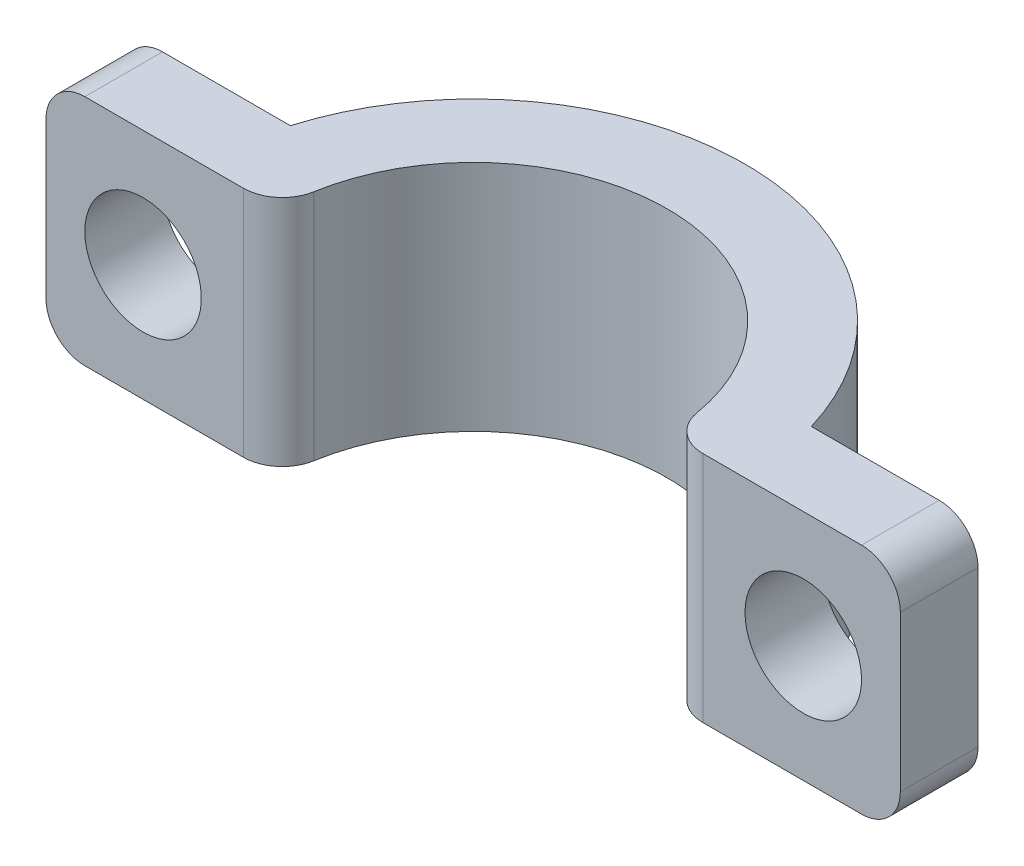
ISO-10303-21;
HEADER;
FILE_DESCRIPTION(('STEP AP214'),'2;1');
FILE_NAME('part.step','',(''),(''),'','','');
FILE_SCHEMA(('AUTOMOTIVE_DESIGN { 1 0 10303 214 1 1 1 1 }'));
ENDSEC;
DATA;
#1=APPLICATION_CONTEXT('core data for automotive mechanical design processes');
#2=APPLICATION_PROTOCOL_DEFINITION('international standard','automotive_design',2000,#1);
#3=PRODUCT_CONTEXT('',#1,'mechanical');
#4=PRODUCT('Part','Part','',(#3));
#5=PRODUCT_RELATED_PRODUCT_CATEGORY('part','',(#4));
#6=PRODUCT_DEFINITION_FORMATION('','',#4);
#7=PRODUCT_DEFINITION_CONTEXT('part definition',#1,'design');
#8=PRODUCT_DEFINITION('design','',#6,#7);
#9=PRODUCT_DEFINITION_SHAPE('','',#8);
#10=(LENGTH_UNIT() NAMED_UNIT(*) SI_UNIT(.MILLI.,.METRE.));
#11=(NAMED_UNIT(*) PLANE_ANGLE_UNIT() SI_UNIT($,.RADIAN.));
#12=(NAMED_UNIT(*) SI_UNIT($,.STERADIAN.) SOLID_ANGLE_UNIT());
#13=UNCERTAINTY_MEASURE_WITH_UNIT(LENGTH_MEASURE(1.E-05),#10,'distance_accuracy_value','');
#14=(GEOMETRIC_REPRESENTATION_CONTEXT(3) GLOBAL_UNCERTAINTY_ASSIGNED_CONTEXT((#13)) GLOBAL_UNIT_ASSIGNED_CONTEXT((#10,
#11,#12)) REPRESENTATION_CONTEXT('',''));
#15=CARTESIAN_POINT('',(0.,0.,0.));
#16=DIRECTION('',(0.,0.,1.));
#17=DIRECTION('',(1.,0.,0.));
#18=AXIS2_PLACEMENT_3D('',#15,#16,#17);
#19=CARTESIAN_POINT('',(0.,6.,0.));
#20=DIRECTION('',(0.,-1.,0.));
#21=DIRECTION('',(0.,0.,-1.));
#22=AXIS2_PLACEMENT_3D('',#19,#20,#21);
#23=CYLINDRICAL_SURFACE('',#22,5.);
#24=CARTESIAN_POINT('',(0.,0.,0.));
#25=DIRECTION('',(0.,-1.,0.));
#26=DIRECTION('',(0.,0.,1.));
#27=AXIS2_PLACEMENT_3D('',#24,#25,#26);
#28=CIRCLE('',#27,5.);
#29=CARTESIAN_POINT('',(-4.93006648591635,0.,-0.833333333333333));
#30=VERTEX_POINT('',#29);
#31=CARTESIAN_POINT('',(4.93006648591635,0.,-0.833333333333333));
#32=VERTEX_POINT('',#31);
#33=EDGE_CURVE('E190',#30,#32,#28,.T.);
#34=ORIENTED_EDGE('',*,*,#33,.T.);
#35=DIRECTION('',(0.,-1.,0.));
#36=VECTOR('',#35,1.);
#37=CARTESIAN_POINT('',(4.93006648591635,6.,-0.833333333333333));
#38=LINE('',#37,#36);
#39=CARTESIAN_POINT('',(4.93006648591635,6.,-0.833333333333333));
#40=VERTEX_POINT('',#39);
#41=EDGE_CURVE('E232',#32,#40,#38,.F.);
#42=ORIENTED_EDGE('',*,*,#41,.T.);
#43=CARTESIAN_POINT('',(0.,6.,0.));
#44=DIRECTION('',(0.,-1.,0.));
#45=DIRECTION('',(0.,0.,1.));
#46=AXIS2_PLACEMENT_3D('',#43,#44,#45);
#47=CIRCLE('',#46,5.);
#48=CARTESIAN_POINT('',(-4.93006648591635,6.,-0.833333333333333));
#49=VERTEX_POINT('',#48);
#50=EDGE_CURVE('E186',#49,#40,#47,.T.);
#51=ORIENTED_EDGE('',*,*,#50,.F.);
#52=DIRECTION('',(0.,-1.,0.));
#53=VECTOR('',#52,1.);
#54=CARTESIAN_POINT('',(-4.93006648591635,6.,-0.833333333333333));
#55=LINE('',#54,#53);
#56=EDGE_CURVE('E228',#49,#30,#55,.T.);
#57=ORIENTED_EDGE('',*,*,#56,.T.);
#58=EDGE_LOOP('',(#34,#42,#51,#57));
#59=FACE_BOUND('',#58,.T.);
#60=ADVANCED_FACE('F43',(#59),#23,.F.);
#61=CARTESIAN_POINT('',(5.,6.,0.));
#62=DIRECTION('',(0.,0.,-1.));
#63=DIRECTION('',(-1.,0.,0.));
#64=AXIS2_PLACEMENT_3D('',#61,#62,#63);
#65=PLANE('',#64);
#66=CARTESIAN_POINT('',(8.5,3.,0.));
#67=DIRECTION('',(0.,0.,-1.));
#68=DIRECTION('',(-1.,0.,0.));
#69=AXIS2_PLACEMENT_3D('',#66,#67,#68);
#70=CIRCLE('',#69,1.5);
#71=CARTESIAN_POINT('',(7.,3.,0.));
#72=VERTEX_POINT('',#71);
#73=EDGE_CURVE('E159',#72,#72,#70,.T.);
#74=ORIENTED_EDGE('',*,*,#73,.T.);
#75=EDGE_LOOP('',(#74));
#76=FACE_BOUND('',#75,.T.);
#77=DIRECTION('',(1.,0.,0.));
#78=VECTOR('',#77,1.);
#79=CARTESIAN_POINT('',(5.,6.,0.));
#80=LINE('',#79,#78);
#81=CARTESIAN_POINT('',(5.91607978309962,6.,0.));
#82=VERTEX_POINT('',#81);
#83=CARTESIAN_POINT('',(10.,6.,0.));
#84=VERTEX_POINT('',#83);
#85=EDGE_CURVE('E178',#82,#84,#80,.T.);
#86=ORIENTED_EDGE('',*,*,#85,.F.);
#87=DIRECTION('',(0.,-1.,0.));
#88=VECTOR('',#87,1.);
#89=CARTESIAN_POINT('',(5.91607978309962,6.,0.));
#90=LINE('',#89,#88);
#91=CARTESIAN_POINT('',(5.91607978309962,0.,0.));
#92=VERTEX_POINT('',#91);
#93=EDGE_CURVE('E210',#82,#92,#90,.T.);
#94=ORIENTED_EDGE('',*,*,#93,.T.);
#95=DIRECTION('',(1.,0.,0.));
#96=VECTOR('',#95,1.);
#97=CARTESIAN_POINT('',(5.,0.,0.));
#98=LINE('',#97,#96);
#99=CARTESIAN_POINT('',(10.,0.,0.));
#100=VERTEX_POINT('',#99);
#101=EDGE_CURVE('E194',#92,#100,#98,.T.);
#102=ORIENTED_EDGE('',*,*,#101,.T.);
#103=CARTESIAN_POINT('',(10.,1.,0.));
#104=DIRECTION('',(0.,0.,-1.));
#105=DIRECTION('',(-1.,0.,0.));
#106=AXIS2_PLACEMENT_3D('',#103,#104,#105);
#107=CIRCLE('',#106,1.);
#108=CARTESIAN_POINT('',(11.,1.,0.));
#109=VERTEX_POINT('',#108);
#110=EDGE_CURVE('E207',#100,#109,#107,.F.);
#111=ORIENTED_EDGE('',*,*,#110,.T.);
#112=DIRECTION('',(0.,1.,0.));
#113=VECTOR('',#112,1.);
#114=CARTESIAN_POINT('',(11.,-4.73492486582563,0.));
#115=LINE('',#114,#113);
#116=CARTESIAN_POINT('',(11.,5.,0.));
#117=VERTEX_POINT('',#116);
#118=EDGE_CURVE('E275',#109,#117,#115,.T.);
#119=ORIENTED_EDGE('',*,*,#118,.T.);
#120=CARTESIAN_POINT('',(10.,5.,0.));
#121=DIRECTION('',(0.,0.,-1.));
#122=DIRECTION('',(-1.,0.,0.));
#123=AXIS2_PLACEMENT_3D('',#120,#121,#122);
#124=CIRCLE('',#123,1.);
#125=EDGE_CURVE('E183',#117,#84,#124,.F.);
#126=ORIENTED_EDGE('',*,*,#125,.T.);
#127=EDGE_LOOP('',(#86,#94,#102,#111,#119,#126));
#128=FACE_BOUND('',#127,.T.);
#129=ADVANCED_FACE('F281',(#76,#128),#65,.F.);
#130=CARTESIAN_POINT('',(0.,6.,0.));
#131=DIRECTION('',(0.,-1.,0.));
#132=DIRECTION('',(0.,0.,-1.));
#133=AXIS2_PLACEMENT_3D('',#130,#131,#132);
#134=CYLINDRICAL_SURFACE('',#133,7.);
#135=CARTESIAN_POINT('',(0.,0.,0.));
#136=DIRECTION('',(0.,1.,0.));
#137=DIRECTION('',(0.,0.,1.));
#138=AXIS2_PLACEMENT_3D('',#135,#136,#137);
#139=CIRCLE('',#138,7.);
#140=CARTESIAN_POINT('',(6.70820393249937,0.,-2.));
#141=VERTEX_POINT('',#140);
#142=CARTESIAN_POINT('',(-6.70820393249937,0.,-2.));
#143=VERTEX_POINT('',#142);
#144=EDGE_CURVE('E167',#141,#143,#139,.T.);
#145=ORIENTED_EDGE('',*,*,#144,.T.);
#146=DIRECTION('',(0.,1.,0.));
#147=VECTOR('',#146,1.);
#148=CARTESIAN_POINT('',(-6.70820393249937,-4.73492486582563,-2.));
#149=LINE('',#148,#147);
#150=CARTESIAN_POINT('',(-6.70820393249937,6.,-2.));
#151=VERTEX_POINT('',#150);
#152=EDGE_CURVE('E148',#143,#151,#149,.T.);
#153=ORIENTED_EDGE('',*,*,#152,.T.);
#154=CARTESIAN_POINT('',(0.,6.,0.));
#155=DIRECTION('',(0.,1.,0.));
#156=DIRECTION('',(0.,0.,1.));
#157=AXIS2_PLACEMENT_3D('',#154,#155,#156);
#158=CIRCLE('',#157,7.);
#159=CARTESIAN_POINT('',(6.70820393249937,6.,-2.));
#160=VERTEX_POINT('',#159);
#161=EDGE_CURVE('E165',#160,#151,#158,.T.);
#162=ORIENTED_EDGE('',*,*,#161,.F.);
#163=DIRECTION('',(0.,1.,0.));
#164=VECTOR('',#163,1.);
#165=CARTESIAN_POINT('',(6.70820393249937,-4.73492486582563,-2.));
#166=LINE('',#165,#164);
#167=EDGE_CURVE('E288',#141,#160,#166,.T.);
#168=ORIENTED_EDGE('',*,*,#167,.F.);
#169=EDGE_LOOP('',(#145,#153,#162,#168));
#170=FACE_BOUND('',#169,.T.);
#171=ADVANCED_FACE('F163',(#170),#134,.T.);
#172=CARTESIAN_POINT('',(-5.,6.,0.));
#173=DIRECTION('',(0.,0.,-1.));
#174=DIRECTION('',(-1.,0.,0.));
#175=AXIS2_PLACEMENT_3D('',#172,#173,#174);
#176=PLANE('',#175);
#177=CARTESIAN_POINT('',(-8.5,3.,0.));
#178=DIRECTION('',(0.,0.,-1.));
#179=DIRECTION('',(-1.,0.,0.));
#180=AXIS2_PLACEMENT_3D('',#177,#178,#179);
#181=CIRCLE('',#180,1.5);
#182=CARTESIAN_POINT('',(-10.,3.,0.));
#183=VERTEX_POINT('',#182);
#184=EDGE_CURVE('E366',#183,#183,#181,.T.);
#185=ORIENTED_EDGE('',*,*,#184,.T.);
#186=EDGE_LOOP('',(#185));
#187=FACE_BOUND('',#186,.T.);
#188=DIRECTION('',(1.,0.,0.));
#189=VECTOR('',#188,1.);
#190=CARTESIAN_POINT('',(-5.,0.,0.));
#191=LINE('',#190,#189);
#192=CARTESIAN_POINT('',(-10.,0.,0.));
#193=VERTEX_POINT('',#192);
#194=CARTESIAN_POINT('',(-5.91607978309962,0.,0.));
#195=VERTEX_POINT('',#194);
#196=EDGE_CURVE('E201',#193,#195,#191,.T.);
#197=ORIENTED_EDGE('',*,*,#196,.T.);
#198=DIRECTION('',(0.,-1.,0.));
#199=VECTOR('',#198,1.);
#200=CARTESIAN_POINT('',(-5.91607978309962,6.,0.));
#201=LINE('',#200,#199);
#202=CARTESIAN_POINT('',(-5.91607978309962,6.,0.));
#203=VERTEX_POINT('',#202);
#204=EDGE_CURVE('E253',#195,#203,#201,.F.);
#205=ORIENTED_EDGE('',*,*,#204,.T.);
#206=DIRECTION('',(1.,0.,0.));
#207=VECTOR('',#206,1.);
#208=CARTESIAN_POINT('',(-5.,6.,0.));
#209=LINE('',#208,#207);
#210=CARTESIAN_POINT('',(-10.,6.,0.));
#211=VERTEX_POINT('',#210);
#212=EDGE_CURVE('E177',#211,#203,#209,.T.);
#213=ORIENTED_EDGE('',*,*,#212,.F.);
#214=CARTESIAN_POINT('',(-10.,5.,0.));
#215=DIRECTION('',(0.,0.,-1.));
#216=DIRECTION('',(-1.,0.,0.));
#217=AXIS2_PLACEMENT_3D('',#214,#215,#216);
#218=CIRCLE('',#217,1.);
#219=CARTESIAN_POINT('',(-11.,5.,0.));
#220=VERTEX_POINT('',#219);
#221=EDGE_CURVE('E247',#211,#220,#218,.F.);
#222=ORIENTED_EDGE('',*,*,#221,.T.);
#223=DIRECTION('',(0.,1.,0.));
#224=VECTOR('',#223,1.);
#225=CARTESIAN_POINT('',(-11.,-4.73492486582563,0.));
#226=LINE('',#225,#224);
#227=CARTESIAN_POINT('',(-11.,1.,0.));
#228=VERTEX_POINT('',#227);
#229=EDGE_CURVE('E170',#228,#220,#226,.T.);
#230=ORIENTED_EDGE('',*,*,#229,.F.);
#231=CARTESIAN_POINT('',(-10.,1.,0.));
#232=DIRECTION('',(0.,0.,-1.));
#233=DIRECTION('',(-1.,0.,0.));
#234=AXIS2_PLACEMENT_3D('',#231,#232,#233);
#235=CIRCLE('',#234,1.);
#236=EDGE_CURVE('E250',#228,#193,#235,.F.);
#237=ORIENTED_EDGE('',*,*,#236,.T.);
#238=EDGE_LOOP('',(#197,#205,#213,#222,#230,#237));
#239=FACE_BOUND('',#238,.T.);
#240=ADVANCED_FACE('F349',(#187,#239),#176,.F.);
#241=CARTESIAN_POINT('',(0.,6.,0.));
#242=DIRECTION('',(0.,1.,0.));
#243=DIRECTION('',(0.,0.,1.));
#244=AXIS2_PLACEMENT_3D('',#241,#242,#243);
#245=PLANE('',#244);
#246=ORIENTED_EDGE('',*,*,#50,.T.);
#247=CARTESIAN_POINT('',(5.91607978309962,6.,-1.));
#248=DIRECTION('',(0.,1.,0.));
#249=DIRECTION('',(0.,0.,1.));
#250=AXIS2_PLACEMENT_3D('',#247,#248,#249);
#251=CIRCLE('',#250,1.);
#252=EDGE_CURVE('E244',#40,#82,#251,.T.);
#253=ORIENTED_EDGE('',*,*,#252,.T.);
#254=ORIENTED_EDGE('',*,*,#85,.T.);
#255=DIRECTION('',(0.,0.,-1.));
#256=VECTOR('',#255,1.);
#257=CARTESIAN_POINT('',(10.,6.,0.));
#258=LINE('',#257,#256);
#259=CARTESIAN_POINT('',(10.,6.,-2.));
#260=VERTEX_POINT('',#259);
#261=EDGE_CURVE('E238',#84,#260,#258,.T.);
#262=ORIENTED_EDGE('',*,*,#261,.T.);
#263=DIRECTION('',(-1.,0.,0.));
#264=VECTOR('',#263,1.);
#265=CARTESIAN_POINT('',(11.,6.,-2.));
#266=LINE('',#265,#264);
#267=EDGE_CURVE('E175',#260,#160,#266,.T.);
#268=ORIENTED_EDGE('',*,*,#267,.T.);
#269=ORIENTED_EDGE('',*,*,#161,.T.);
#270=DIRECTION('',(-1.,0.,0.));
#271=VECTOR('',#270,1.);
#272=CARTESIAN_POINT('',(-11.,6.,-2.));
#273=LINE('',#272,#271);
#274=CARTESIAN_POINT('',(-10.,6.,-2.));
#275=VERTEX_POINT('',#274);
#276=EDGE_CURVE('E144',#151,#275,#273,.T.);
#277=ORIENTED_EDGE('',*,*,#276,.T.);
#278=DIRECTION('',(0.,0.,1.));
#279=VECTOR('',#278,1.);
#280=CARTESIAN_POINT('',(-10.,6.,0.));
#281=LINE('',#280,#279);
#282=EDGE_CURVE('E235',#275,#211,#281,.T.);
#283=ORIENTED_EDGE('',*,*,#282,.T.);
#284=ORIENTED_EDGE('',*,*,#212,.T.);
#285=CARTESIAN_POINT('',(-5.91607978309962,6.,-1.));
#286=DIRECTION('',(0.,1.,0.));
#287=DIRECTION('',(0.,0.,1.));
#288=AXIS2_PLACEMENT_3D('',#285,#286,#287);
#289=CIRCLE('',#288,1.);
#290=EDGE_CURVE('E241',#203,#49,#289,.T.);
#291=ORIENTED_EDGE('',*,*,#290,.T.);
#292=EDGE_LOOP('',(#246,#253,#254,#262,#268,#269,#277,#283,#284,#291));
#293=FACE_BOUND('',#292,.T.);
#294=ADVANCED_FACE('F173',(#293),#245,.T.);
#295=CARTESIAN_POINT('',(0.,0.,0.));
#296=DIRECTION('',(0.,1.,0.));
#297=DIRECTION('',(0.,0.,1.));
#298=AXIS2_PLACEMENT_3D('',#295,#296,#297);
#299=PLANE('',#298);
#300=ORIENTED_EDGE('',*,*,#101,.F.);
#301=CARTESIAN_POINT('',(5.91607978309962,0.,-1.));
#302=DIRECTION('',(0.,1.,0.));
#303=DIRECTION('',(0.,0.,1.));
#304=AXIS2_PLACEMENT_3D('',#301,#302,#303);
#305=CIRCLE('',#304,1.);
#306=EDGE_CURVE('E225',#92,#32,#305,.F.);
#307=ORIENTED_EDGE('',*,*,#306,.T.);
#308=ORIENTED_EDGE('',*,*,#33,.F.);
#309=CARTESIAN_POINT('',(-5.91607978309962,0.,-1.));
#310=DIRECTION('',(0.,1.,0.));
#311=DIRECTION('',(0.,0.,1.));
#312=AXIS2_PLACEMENT_3D('',#309,#310,#311);
#313=CIRCLE('',#312,1.);
#314=EDGE_CURVE('E222',#30,#195,#313,.F.);
#315=ORIENTED_EDGE('',*,*,#314,.T.);
#316=ORIENTED_EDGE('',*,*,#196,.F.);
#317=DIRECTION('',(0.,0.,-1.));
#318=VECTOR('',#317,1.);
#319=CARTESIAN_POINT('',(-10.,0.,-2.));
#320=LINE('',#319,#318);
#321=CARTESIAN_POINT('',(-10.,0.,-2.));
#322=VERTEX_POINT('',#321);
#323=EDGE_CURVE('E218',#193,#322,#320,.T.);
#324=ORIENTED_EDGE('',*,*,#323,.T.);
#325=DIRECTION('',(1.,0.,0.));
#326=VECTOR('',#325,1.);
#327=CARTESIAN_POINT('',(-11.,0.,-2.));
#328=LINE('',#327,#326);
#329=EDGE_CURVE('E169',#322,#143,#328,.T.);
#330=ORIENTED_EDGE('',*,*,#329,.T.);
#331=ORIENTED_EDGE('',*,*,#144,.F.);
#332=DIRECTION('',(1.,0.,0.));
#333=VECTOR('',#332,1.);
#334=CARTESIAN_POINT('',(11.,0.,-2.));
#335=LINE('',#334,#333);
#336=CARTESIAN_POINT('',(10.,0.,-2.));
#337=VERTEX_POINT('',#336);
#338=EDGE_CURVE('E195',#141,#337,#335,.T.);
#339=ORIENTED_EDGE('',*,*,#338,.T.);
#340=DIRECTION('',(0.,0.,1.));
#341=VECTOR('',#340,1.);
#342=CARTESIAN_POINT('',(10.,0.,0.));
#343=LINE('',#342,#341);
#344=EDGE_CURVE('E214',#337,#100,#343,.T.);
#345=ORIENTED_EDGE('',*,*,#344,.T.);
#346=EDGE_LOOP('',(#300,#307,#308,#315,#316,#324,#330,#331,#339,#345));
#347=FACE_BOUND('',#346,.T.);
#348=ADVANCED_FACE('F311',(#347),#299,.F.);
#349=CARTESIAN_POINT('',(11.,-4.73492486582563,-2.));
#350=DIRECTION('',(0.,0.,-1.));
#351=DIRECTION('',(-1.,0.,0.));
#352=AXIS2_PLACEMENT_3D('',#349,#350,#351);
#353=PLANE('',#352);
#354=CARTESIAN_POINT('',(8.5,3.,-2.));
#355=DIRECTION('',(0.,0.,-1.));
#356=DIRECTION('',(-1.,0.,0.));
#357=AXIS2_PLACEMENT_3D('',#354,#355,#356);
#358=CIRCLE('',#357,1.5);
#359=CARTESIAN_POINT('',(7.,3.,-2.));
#360=VERTEX_POINT('',#359);
#361=EDGE_CURVE('E370',#360,#360,#358,.T.);
#362=ORIENTED_EDGE('',*,*,#361,.F.);
#363=EDGE_LOOP('',(#362));
#364=FACE_BOUND('',#363,.T.);
#365=DIRECTION('',(0.,1.,0.));
#366=VECTOR('',#365,1.);
#367=CARTESIAN_POINT('',(11.,-4.73492486582563,-2.));
#368=LINE('',#367,#366);
#369=CARTESIAN_POINT('',(11.,1.,-2.));
#370=VERTEX_POINT('',#369);
#371=CARTESIAN_POINT('',(11.,5.,-2.));
#372=VERTEX_POINT('',#371);
#373=EDGE_CURVE('E276',#370,#372,#368,.T.);
#374=ORIENTED_EDGE('',*,*,#373,.F.);
#375=CARTESIAN_POINT('',(10.,1.,-2.));
#376=DIRECTION('',(0.,0.,-1.));
#377=DIRECTION('',(-1.,0.,0.));
#378=AXIS2_PLACEMENT_3D('',#375,#376,#377);
#379=CIRCLE('',#378,1.);
#380=EDGE_CURVE('E11',#370,#337,#379,.T.);
#381=ORIENTED_EDGE('',*,*,#380,.T.);
#382=ORIENTED_EDGE('',*,*,#338,.F.);
#383=ORIENTED_EDGE('',*,*,#167,.T.);
#384=ORIENTED_EDGE('',*,*,#267,.F.);
#385=CARTESIAN_POINT('',(10.,5.,-2.));
#386=DIRECTION('',(0.,0.,-1.));
#387=DIRECTION('',(-1.,0.,0.));
#388=AXIS2_PLACEMENT_3D('',#385,#386,#387);
#389=CIRCLE('',#388,1.);
#390=EDGE_CURVE('E52',#260,#372,#389,.T.);
#391=ORIENTED_EDGE('',*,*,#390,.T.);
#392=EDGE_LOOP('',(#374,#381,#382,#383,#384,#391));
#393=FACE_BOUND('',#392,.T.);
#394=ADVANCED_FACE('F286',(#364,#393),#353,.T.);
#395=CARTESIAN_POINT('',(11.,-4.73492486582563,0.));
#396=DIRECTION('',(1.,0.,0.));
#397=DIRECTION('',(0.,0.,-1.));
#398=AXIS2_PLACEMENT_3D('',#395,#396,#397);
#399=PLANE('',#398);
#400=ORIENTED_EDGE('',*,*,#118,.F.);
#401=DIRECTION('',(0.,0.,1.));
#402=VECTOR('',#401,1.);
#403=CARTESIAN_POINT('',(11.,1.,-2.));
#404=LINE('',#403,#402);
#405=EDGE_CURVE('E65',#109,#370,#404,.F.);
#406=ORIENTED_EDGE('',*,*,#405,.T.);
#407=ORIENTED_EDGE('',*,*,#373,.T.);
#408=DIRECTION('',(0.,0.,-1.));
#409=VECTOR('',#408,1.);
#410=CARTESIAN_POINT('',(11.,5.,0.));
#411=LINE('',#410,#409);
#412=EDGE_CURVE('E267',#372,#117,#411,.F.);
#413=ORIENTED_EDGE('',*,*,#412,.T.);
#414=EDGE_LOOP('',(#400,#406,#407,#413));
#415=FACE_BOUND('',#414,.T.);
#416=ADVANCED_FACE('F274',(#415),#399,.T.);
#417=CARTESIAN_POINT('',(-11.,-4.73492486582563,-2.));
#418=DIRECTION('',(0.,0.,-1.));
#419=DIRECTION('',(-1.,0.,0.));
#420=AXIS2_PLACEMENT_3D('',#417,#418,#419);
#421=PLANE('',#420);
#422=CARTESIAN_POINT('',(-8.5,3.,-2.));
#423=DIRECTION('',(0.,0.,-1.));
#424=DIRECTION('',(1.,0.,0.));
#425=AXIS2_PLACEMENT_3D('',#422,#423,#424);
#426=CIRCLE('',#425,1.5);
#427=CARTESIAN_POINT('',(-7.,3.,-2.));
#428=VERTEX_POINT('',#427);
#429=EDGE_CURVE('E371',#428,#428,#426,.T.);
#430=ORIENTED_EDGE('',*,*,#429,.F.);
#431=EDGE_LOOP('',(#430));
#432=FACE_BOUND('',#431,.T.);
#433=ORIENTED_EDGE('',*,*,#329,.F.);
#434=CARTESIAN_POINT('',(-10.,1.,-2.));
#435=DIRECTION('',(0.,0.,-1.));
#436=DIRECTION('',(-1.,0.,0.));
#437=AXIS2_PLACEMENT_3D('',#434,#435,#436);
#438=CIRCLE('',#437,1.);
#439=CARTESIAN_POINT('',(-11.,1.,-2.));
#440=VERTEX_POINT('',#439);
#441=EDGE_CURVE('E258',#322,#440,#438,.T.);
#442=ORIENTED_EDGE('',*,*,#441,.T.);
#443=DIRECTION('',(0.,1.,0.));
#444=VECTOR('',#443,1.);
#445=CARTESIAN_POINT('',(-11.,-4.73492486582563,-2.));
#446=LINE('',#445,#444);
#447=CARTESIAN_POINT('',(-11.,5.,-2.));
#448=VERTEX_POINT('',#447);
#449=EDGE_CURVE('E158',#440,#448,#446,.T.);
#450=ORIENTED_EDGE('',*,*,#449,.T.);
#451=CARTESIAN_POINT('',(-10.,5.,-2.));
#452=DIRECTION('',(0.,0.,-1.));
#453=DIRECTION('',(-1.,0.,0.));
#454=AXIS2_PLACEMENT_3D('',#451,#452,#453);
#455=CIRCLE('',#454,1.);
#456=EDGE_CURVE('E152',#448,#275,#455,.T.);
#457=ORIENTED_EDGE('',*,*,#456,.T.);
#458=ORIENTED_EDGE('',*,*,#276,.F.);
#459=ORIENTED_EDGE('',*,*,#152,.F.);
#460=EDGE_LOOP('',(#433,#442,#450,#457,#458,#459));
#461=FACE_BOUND('',#460,.T.);
#462=ADVANCED_FACE('F147',(#432,#461),#421,.T.);
#463=CARTESIAN_POINT('',(-11.,-4.73492486582563,0.));
#464=DIRECTION('',(-1.,0.,0.));
#465=DIRECTION('',(0.,0.,1.));
#466=AXIS2_PLACEMENT_3D('',#463,#464,#465);
#467=PLANE('',#466);
#468=ORIENTED_EDGE('',*,*,#449,.F.);
#469=DIRECTION('',(0.,0.,-1.));
#470=VECTOR('',#469,1.);
#471=CARTESIAN_POINT('',(-11.,1.,0.));
#472=LINE('',#471,#470);
#473=EDGE_CURVE('E264',#440,#228,#472,.F.);
#474=ORIENTED_EDGE('',*,*,#473,.T.);
#475=ORIENTED_EDGE('',*,*,#229,.T.);
#476=DIRECTION('',(0.,0.,1.));
#477=VECTOR('',#476,1.);
#478=CARTESIAN_POINT('',(-11.,5.,0.));
#479=LINE('',#478,#477);
#480=EDGE_CURVE('E261',#220,#448,#479,.F.);
#481=ORIENTED_EDGE('',*,*,#480,.T.);
#482=EDGE_LOOP('',(#468,#474,#475,#481));
#483=FACE_BOUND('',#482,.T.);
#484=ADVANCED_FACE('F357',(#483),#467,.T.);
#485=CARTESIAN_POINT('',(-8.5,3.,4.));
#486=DIRECTION('',(0.,0.,-1.));
#487=DIRECTION('',(-1.,0.,0.));
#488=AXIS2_PLACEMENT_3D('',#485,#486,#487);
#489=CYLINDRICAL_SURFACE('',#488,1.5);
#490=ORIENTED_EDGE('',*,*,#429,.T.);
#491=EDGE_LOOP('',(#490));
#492=FACE_BOUND('',#491,.T.);
#493=ORIENTED_EDGE('',*,*,#184,.F.);
#494=EDGE_LOOP('',(#493));
#495=FACE_BOUND('',#494,.T.);
#496=ADVANCED_FACE('F442',(#492,#495),#489,.F.);
#497=CARTESIAN_POINT('',(8.5,3.,4.));
#498=DIRECTION('',(0.,0.,-1.));
#499=DIRECTION('',(-1.,0.,0.));
#500=AXIS2_PLACEMENT_3D('',#497,#498,#499);
#501=CYLINDRICAL_SURFACE('',#500,1.5);
#502=ORIENTED_EDGE('',*,*,#361,.T.);
#503=EDGE_LOOP('',(#502));
#504=FACE_BOUND('',#503,.T.);
#505=ORIENTED_EDGE('',*,*,#73,.F.);
#506=EDGE_LOOP('',(#505));
#507=FACE_BOUND('',#506,.T.);
#508=ADVANCED_FACE('F340',(#504,#507),#501,.F.);
#509=CARTESIAN_POINT('',(5.91607978309962,6.,-1.));
#510=DIRECTION('',(0.,-1.,0.));
#511=DIRECTION('',(0.,0.,-1.));
#512=AXIS2_PLACEMENT_3D('',#509,#510,#511);
#513=CYLINDRICAL_SURFACE('',#512,1.);
#514=ORIENTED_EDGE('',*,*,#252,.F.);
#515=ORIENTED_EDGE('',*,*,#41,.F.);
#516=ORIENTED_EDGE('',*,*,#306,.F.);
#517=ORIENTED_EDGE('',*,*,#93,.F.);
#518=EDGE_LOOP('',(#514,#515,#516,#517));
#519=FACE_BOUND('',#518,.T.);
#520=ADVANCED_FACE('F308',(#519),#513,.T.);
#521=CARTESIAN_POINT('',(-5.91607978309962,6.,-1.));
#522=DIRECTION('',(0.,-1.,0.));
#523=DIRECTION('',(0.,0.,-1.));
#524=AXIS2_PLACEMENT_3D('',#521,#522,#523);
#525=CYLINDRICAL_SURFACE('',#524,1.);
#526=ORIENTED_EDGE('',*,*,#290,.F.);
#527=ORIENTED_EDGE('',*,*,#204,.F.);
#528=ORIENTED_EDGE('',*,*,#314,.F.);
#529=ORIENTED_EDGE('',*,*,#56,.F.);
#530=EDGE_LOOP('',(#526,#527,#528,#529));
#531=FACE_BOUND('',#530,.T.);
#532=ADVANCED_FACE('F326',(#531),#525,.T.);
#533=CARTESIAN_POINT('',(-10.,1.,0.));
#534=DIRECTION('',(0.,0.,1.));
#535=DIRECTION('',(1.,0.,0.));
#536=AXIS2_PLACEMENT_3D('',#533,#534,#535);
#537=CYLINDRICAL_SURFACE('',#536,1.);
#538=ORIENTED_EDGE('',*,*,#236,.F.);
#539=ORIENTED_EDGE('',*,*,#473,.F.);
#540=ORIENTED_EDGE('',*,*,#441,.F.);
#541=ORIENTED_EDGE('',*,*,#323,.F.);
#542=EDGE_LOOP('',(#538,#539,#540,#541));
#543=FACE_BOUND('',#542,.T.);
#544=ADVANCED_FACE('F320',(#543),#537,.T.);
#545=CARTESIAN_POINT('',(10.,1.,0.));
#546=DIRECTION('',(0.,0.,-1.));
#547=DIRECTION('',(-1.,0.,0.));
#548=AXIS2_PLACEMENT_3D('',#545,#546,#547);
#549=CYLINDRICAL_SURFACE('',#548,1.);
#550=ORIENTED_EDGE('',*,*,#380,.F.);
#551=ORIENTED_EDGE('',*,*,#405,.F.);
#552=ORIENTED_EDGE('',*,*,#110,.F.);
#553=ORIENTED_EDGE('',*,*,#344,.F.);
#554=EDGE_LOOP('',(#550,#551,#552,#553));
#555=FACE_BOUND('',#554,.T.);
#556=ADVANCED_FACE('F317',(#555),#549,.T.);
#557=CARTESIAN_POINT('',(10.,5.,0.));
#558=DIRECTION('',(0.,0.,-1.));
#559=DIRECTION('',(-1.,0.,0.));
#560=AXIS2_PLACEMENT_3D('',#557,#558,#559);
#561=CYLINDRICAL_SURFACE('',#560,1.);
#562=ORIENTED_EDGE('',*,*,#125,.F.);
#563=ORIENTED_EDGE('',*,*,#412,.F.);
#564=ORIENTED_EDGE('',*,*,#390,.F.);
#565=ORIENTED_EDGE('',*,*,#261,.F.);
#566=EDGE_LOOP('',(#562,#563,#564,#565));
#567=FACE_BOUND('',#566,.T.);
#568=ADVANCED_FACE('F285',(#567),#561,.T.);
#569=CARTESIAN_POINT('',(-10.,5.,0.));
#570=DIRECTION('',(0.,0.,1.));
#571=DIRECTION('',(1.,0.,0.));
#572=AXIS2_PLACEMENT_3D('',#569,#570,#571);
#573=CYLINDRICAL_SURFACE('',#572,1.);
#574=ORIENTED_EDGE('',*,*,#456,.F.);
#575=ORIENTED_EDGE('',*,*,#480,.F.);
#576=ORIENTED_EDGE('',*,*,#221,.F.);
#577=ORIENTED_EDGE('',*,*,#282,.F.);
#578=EDGE_LOOP('',(#574,#575,#576,#577));
#579=FACE_BOUND('',#578,.T.);
#580=ADVANCED_FACE('F45',(#579),#573,.T.);
#581=CLOSED_SHELL('',(#60,#129,#171,#240,#294,#348,#394,#416,#462,#484,#496,#508,#520,#532,#544,
#556,#568,#580));
#582=MANIFOLD_SOLID_BREP('B2',#581);
#583=ADVANCED_BREP_SHAPE_REPRESENTATION('',(#18,#582),#14);
#584=SHAPE_DEFINITION_REPRESENTATION(#9,#583);
ENDSEC;
END-ISO-10303-21;
